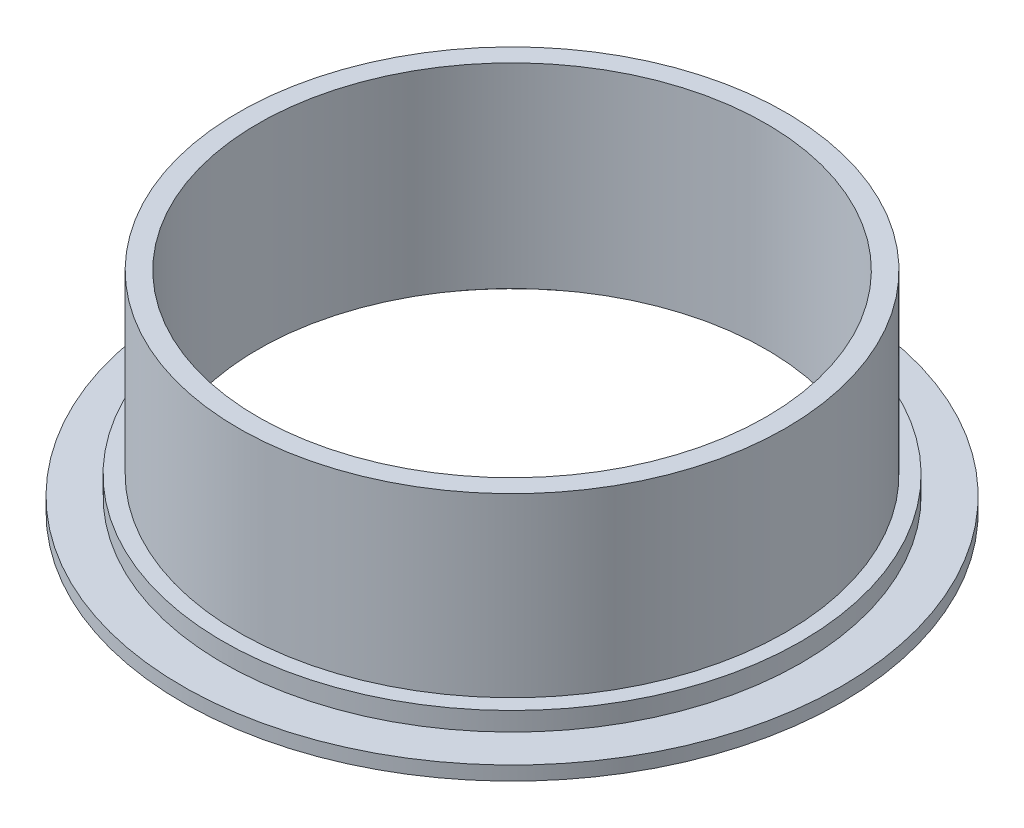
ISO-10303-21;
HEADER;
FILE_DESCRIPTION(('STEP AP214'),'2;1');
FILE_NAME('part.step','',(''),(''),'','','');
FILE_SCHEMA(('AUTOMOTIVE_DESIGN { 1 0 10303 214 1 1 1 1 }'));
ENDSEC;
DATA;
#1=APPLICATION_CONTEXT('core data for automotive mechanical design processes');
#2=APPLICATION_PROTOCOL_DEFINITION('international standard','automotive_design',2000,#1);
#3=PRODUCT_CONTEXT('',#1,'mechanical');
#4=PRODUCT('Part','Part','',(#3));
#5=PRODUCT_RELATED_PRODUCT_CATEGORY('part','',(#4));
#6=PRODUCT_DEFINITION_FORMATION('','',#4);
#7=PRODUCT_DEFINITION_CONTEXT('part definition',#1,'design');
#8=PRODUCT_DEFINITION('design','',#6,#7);
#9=PRODUCT_DEFINITION_SHAPE('','',#8);
#10=(LENGTH_UNIT() NAMED_UNIT(*) SI_UNIT(.MILLI.,.METRE.));
#11=(NAMED_UNIT(*) PLANE_ANGLE_UNIT() SI_UNIT($,.RADIAN.));
#12=(NAMED_UNIT(*) SI_UNIT($,.STERADIAN.) SOLID_ANGLE_UNIT());
#13=UNCERTAINTY_MEASURE_WITH_UNIT(LENGTH_MEASURE(1.E-05),#10,'distance_accuracy_value','');
#14=(GEOMETRIC_REPRESENTATION_CONTEXT(3) GLOBAL_UNCERTAINTY_ASSIGNED_CONTEXT((#13)) GLOBAL_UNIT_ASSIGNED_CONTEXT((#10,
#11,#12)) REPRESENTATION_CONTEXT('',''));
#15=CARTESIAN_POINT('',(0.,0.,0.));
#16=DIRECTION('',(0.,0.,1.));
#17=DIRECTION('',(1.,0.,0.));
#18=AXIS2_PLACEMENT_3D('',#15,#16,#17);
#19=CARTESIAN_POINT('',(-650.,535.75794621027,0.));
#20=DIRECTION('',(0.,-1.,0.));
#21=DIRECTION('',(1.,0.,0.));
#22=AXIS2_PLACEMENT_3D('',#19,#20,#21);
#23=PLANE('',#22);
#24=CARTESIAN_POINT('',(-1.83778315863287E-12,535.757946210271,0.));
#25=DIRECTION('',(0.,-1.,0.));
#26=DIRECTION('',(1.,0.,0.));
#27=AXIS2_PLACEMENT_3D('',#24,#25,#26);
#28=CIRCLE('',#27,699.999999999998);
#29=CARTESIAN_POINT('',(699.999999999996,535.757946210274,0.));
#30=VERTEX_POINT('',#29);
#31=EDGE_CURVE('E10',#30,#30,#28,.T.);
#32=ORIENTED_EDGE('',*,*,#31,.F.);
#33=EDGE_LOOP('',(#32));
#34=FACE_BOUND('',#33,.T.);
#35=CARTESIAN_POINT('',(-1.83778315863287E-12,535.757946210271,0.));
#36=DIRECTION('',(0.,-1.,0.));
#37=DIRECTION('',(1.,0.,0.));
#38=AXIS2_PLACEMENT_3D('',#35,#36,#37);
#39=CIRCLE('',#38,649.999999999998);
#40=CARTESIAN_POINT('',(649.999999999996,535.757946210274,0.));
#41=VERTEX_POINT('',#40);
#42=EDGE_CURVE('E80',#41,#41,#39,.T.);
#43=ORIENTED_EDGE('',*,*,#42,.T.);
#44=EDGE_LOOP('',(#43));
#45=FACE_BOUND('',#44,.T.);
#46=ADVANCED_FACE('F37',(#34,#45),#23,.F.);
#47=CARTESIAN_POINT('',(2.87552303238576E-11,-8382.84052650349,0.));
#48=DIRECTION('',(0.,-1.,0.));
#49=DIRECTION('',(1.,0.,0.));
#50=AXIS2_PLACEMENT_3D('',#47,#48,#49);
#51=CYLINDRICAL_SURFACE('',#50,699.999999999999);
#52=CARTESIAN_POINT('',(-2.86882216017888E-13,83.6330587403662,0.));
#53=DIRECTION('',(0.,-1.,0.));
#54=DIRECTION('',(1.,0.,0.));
#55=AXIS2_PLACEMENT_3D('',#52,#53,#54);
#56=CIRCLE('',#55,700.);
#57=CARTESIAN_POINT('',(700.,83.6330587403686,0.));
#58=VERTEX_POINT('',#57);
#59=EDGE_CURVE('E44',#58,#58,#56,.T.);
#60=ORIENTED_EDGE('',*,*,#59,.F.);
#61=EDGE_LOOP('',(#60));
#62=FACE_BOUND('',#61,.T.);
#63=ORIENTED_EDGE('',*,*,#31,.T.);
#64=EDGE_LOOP('',(#63));
#65=FACE_BOUND('',#64,.T.);
#66=ADVANCED_FACE('F130',(#62,#65),#51,.T.);
#67=CARTESIAN_POINT('',(-700.,83.6330587403636,0.));
#68=DIRECTION('',(0.,-1.,0.));
#69=DIRECTION('',(1.,0.,0.));
#70=AXIS2_PLACEMENT_3D('',#67,#68,#69);
#71=PLANE('',#70);
#72=CARTESIAN_POINT('',(-2.86882216017888E-13,83.6330587403662,0.));
#73=DIRECTION('',(0.,-1.,0.));
#74=DIRECTION('',(1.,0.,0.));
#75=AXIS2_PLACEMENT_3D('',#72,#73,#74);
#76=CIRCLE('',#75,740.);
#77=CARTESIAN_POINT('',(739.999999999999,83.6330587403687,0.));
#78=VERTEX_POINT('',#77);
#79=EDGE_CURVE('E49',#78,#78,#76,.T.);
#80=ORIENTED_EDGE('',*,*,#79,.F.);
#81=EDGE_LOOP('',(#80));
#82=FACE_BOUND('',#81,.T.);
#83=ORIENTED_EDGE('',*,*,#59,.T.);
#84=EDGE_LOOP('',(#83));
#85=FACE_BOUND('',#84,.T.);
#86=ADVANCED_FACE('F125',(#82,#85),#71,.F.);
#87=CARTESIAN_POINT('',(2.87552303238576E-11,-8382.84052650349,0.));
#88=DIRECTION('',(0.,-1.,0.));
#89=DIRECTION('',(1.,0.,0.));
#90=AXIS2_PLACEMENT_3D('',#87,#88,#89);
#91=CYLINDRICAL_SURFACE('',#90,740.);
#92=CARTESIAN_POINT('',(-1.22658659189986E-13,35.7579462102713,0.));
#93=DIRECTION('',(0.,-1.,0.));
#94=DIRECTION('',(1.,0.,0.));
#95=AXIS2_PLACEMENT_3D('',#92,#93,#94);
#96=CIRCLE('',#95,740.);
#97=CARTESIAN_POINT('',(740.,35.7579462102738,0.));
#98=VERTEX_POINT('',#97);
#99=EDGE_CURVE('E54',#98,#98,#96,.T.);
#100=ORIENTED_EDGE('',*,*,#99,.F.);
#101=EDGE_LOOP('',(#100));
#102=FACE_BOUND('',#101,.T.);
#103=ORIENTED_EDGE('',*,*,#79,.T.);
#104=EDGE_LOOP('',(#103));
#105=FACE_BOUND('',#104,.T.);
#106=ADVANCED_FACE('F119',(#102,#105),#91,.T.);
#107=CARTESIAN_POINT('',(-740.,35.7579462102691,0.));
#108=DIRECTION('',(0.,-1.,0.));
#109=DIRECTION('',(1.,0.,0.));
#110=AXIS2_PLACEMENT_3D('',#107,#108,#109);
#111=PLANE('',#110);
#112=CARTESIAN_POINT('',(-1.22658659189993E-13,35.7579462102731,0.));
#113=DIRECTION('',(0.,-1.,0.));
#114=DIRECTION('',(1.,0.,0.));
#115=AXIS2_PLACEMENT_3D('',#112,#113,#114);
#116=CIRCLE('',#115,843.170504669245);
#117=CARTESIAN_POINT('',(843.170504669245,35.757946210276,0.));
#118=VERTEX_POINT('',#117);
#119=EDGE_CURVE('E60',#118,#118,#116,.T.);
#120=ORIENTED_EDGE('',*,*,#119,.F.);
#121=EDGE_LOOP('',(#120));
#122=FACE_BOUND('',#121,.T.);
#123=ORIENTED_EDGE('',*,*,#99,.T.);
#124=EDGE_LOOP('',(#123));
#125=FACE_BOUND('',#124,.T.);
#126=ADVANCED_FACE('F113',(#122,#125),#111,.F.);
#127=CARTESIAN_POINT('',(2.87552303238576E-11,-8382.84052650349,0.));
#128=DIRECTION('',(0.,-1.,0.));
#129=DIRECTION('',(1.,0.,0.));
#130=AXIS2_PLACEMENT_3D('',#127,#128,#129);
#131=CYLINDRICAL_SURFACE('',#130,843.170504669245);
#132=CARTESIAN_POINT('',(0.,3.5527136788005E-12,0.));
#133=DIRECTION('',(0.,-1.,0.));
#134=DIRECTION('',(1.,0.,0.));
#135=AXIS2_PLACEMENT_3D('',#132,#133,#134);
#136=CIRCLE('',#135,843.170504669246);
#137=CARTESIAN_POINT('',(843.170504669246,6.44499845833219E-12,0.));
#138=VERTEX_POINT('',#137);
#139=EDGE_CURVE('E64',#138,#138,#136,.T.);
#140=ORIENTED_EDGE('',*,*,#139,.F.);
#141=EDGE_LOOP('',(#140));
#142=FACE_BOUND('',#141,.T.);
#143=ORIENTED_EDGE('',*,*,#119,.T.);
#144=EDGE_LOOP('',(#143));
#145=FACE_BOUND('',#144,.T.);
#146=ADVANCED_FACE('F107',(#142,#145),#131,.T.);
#147=CARTESIAN_POINT('',(-700.,0.,0.));
#148=DIRECTION('',(0.,1.,0.));
#149=DIRECTION('',(-1.,0.,0.));
#150=AXIS2_PLACEMENT_3D('',#147,#148,#149);
#151=PLANE('',#150);
#152=CARTESIAN_POINT('',(0.,1.77635683940025E-12,0.));
#153=DIRECTION('',(0.,-1.,0.));
#154=DIRECTION('',(1.,0.,0.));
#155=AXIS2_PLACEMENT_3D('',#152,#153,#154);
#156=CIRCLE('',#155,700.);
#157=CARTESIAN_POINT('',(700.,4.17753113862029E-12,0.));
#158=VERTEX_POINT('',#157);
#159=EDGE_CURVE('E68',#158,#158,#156,.T.);
#160=ORIENTED_EDGE('',*,*,#159,.F.);
#161=EDGE_LOOP('',(#160));
#162=FACE_BOUND('',#161,.T.);
#163=ORIENTED_EDGE('',*,*,#139,.T.);
#164=EDGE_LOOP('',(#163));
#165=FACE_BOUND('',#164,.T.);
#166=ADVANCED_FACE('F101',(#162,#165),#151,.F.);
#167=CARTESIAN_POINT('',(2.87552303238576E-11,-8382.84052650349,0.));
#168=DIRECTION('',(0.,-1.,0.));
#169=DIRECTION('',(1.,0.,0.));
#170=AXIS2_PLACEMENT_3D('',#167,#168,#169);
#171=CYLINDRICAL_SURFACE('',#170,700.);
#172=CARTESIAN_POINT('',(-1.22658659189986E-13,35.7579462102713,0.));
#173=DIRECTION('',(0.,-1.,0.));
#174=DIRECTION('',(1.,0.,0.));
#175=AXIS2_PLACEMENT_3D('',#172,#173,#174);
#176=CIRCLE('',#175,700.);
#177=CARTESIAN_POINT('',(700.,35.7579462102737,0.));
#178=VERTEX_POINT('',#177);
#179=EDGE_CURVE('E72',#178,#178,#176,.T.);
#180=ORIENTED_EDGE('',*,*,#179,.F.);
#181=EDGE_LOOP('',(#180));
#182=FACE_BOUND('',#181,.T.);
#183=ORIENTED_EDGE('',*,*,#159,.T.);
#184=EDGE_LOOP('',(#183));
#185=FACE_BOUND('',#184,.T.);
#186=ADVANCED_FACE('F95',(#182,#185),#171,.F.);
#187=CARTESIAN_POINT('',(-650.,35.757946210269,0.));
#188=DIRECTION('',(0.,1.,0.));
#189=DIRECTION('',(-1.,0.,0.));
#190=AXIS2_PLACEMENT_3D('',#187,#188,#189);
#191=PLANE('',#190);
#192=CARTESIAN_POINT('',(-1.22658659189986E-13,35.7579462102713,0.));
#193=DIRECTION('',(0.,-1.,0.));
#194=DIRECTION('',(1.,0.,0.));
#195=AXIS2_PLACEMENT_3D('',#192,#193,#194);
#196=CIRCLE('',#195,650.);
#197=CARTESIAN_POINT('',(650.,35.7579462102735,0.));
#198=VERTEX_POINT('',#197);
#199=EDGE_CURVE('E76',#198,#198,#196,.T.);
#200=ORIENTED_EDGE('',*,*,#199,.F.);
#201=EDGE_LOOP('',(#200));
#202=FACE_BOUND('',#201,.T.);
#203=ORIENTED_EDGE('',*,*,#179,.T.);
#204=EDGE_LOOP('',(#203));
#205=FACE_BOUND('',#204,.T.);
#206=ADVANCED_FACE('F89',(#202,#205),#191,.F.);
#207=CARTESIAN_POINT('',(2.87552303238576E-11,-8382.84052650349,0.));
#208=DIRECTION('',(0.,-1.,0.));
#209=DIRECTION('',(1.,0.,0.));
#210=AXIS2_PLACEMENT_3D('',#207,#208,#209);
#211=CYLINDRICAL_SURFACE('',#210,649.999999999999);
#212=ORIENTED_EDGE('',*,*,#42,.F.);
#213=EDGE_LOOP('',(#212));
#214=FACE_BOUND('',#213,.T.);
#215=ORIENTED_EDGE('',*,*,#199,.T.);
#216=EDGE_LOOP('',(#215));
#217=FACE_BOUND('',#216,.T.);
#218=ADVANCED_FACE('F86',(#214,#217),#211,.F.);
#219=CLOSED_SHELL('',(#46,#66,#86,#106,#126,#146,#166,#186,#206,#218));
#220=MANIFOLD_SOLID_BREP('B2',#219);
#221=ADVANCED_BREP_SHAPE_REPRESENTATION('',(#18,#220),#14);
#222=SHAPE_DEFINITION_REPRESENTATION(#9,#221);
ENDSEC;
END-ISO-10303-21;
